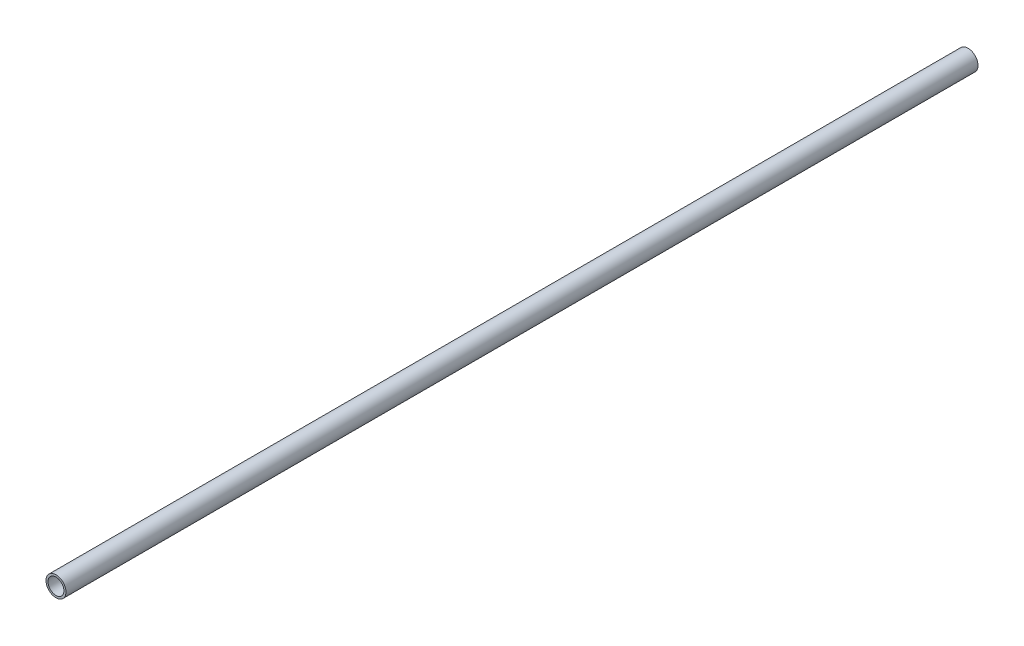
ISO-10303-21;
HEADER;
FILE_DESCRIPTION(('STEP AP214'),'2;1');
FILE_NAME('part.step','',(''),(''),'','','');
FILE_SCHEMA(('AUTOMOTIVE_DESIGN { 1 0 10303 214 1 1 1 1 }'));
ENDSEC;
DATA;
#1=APPLICATION_CONTEXT('core data for automotive mechanical design processes');
#2=APPLICATION_PROTOCOL_DEFINITION('international standard','automotive_design',2000,#1);
#3=PRODUCT_CONTEXT('',#1,'mechanical');
#4=PRODUCT('Part','Part','',(#3));
#5=PRODUCT_RELATED_PRODUCT_CATEGORY('part','',(#4));
#6=PRODUCT_DEFINITION_FORMATION('','',#4);
#7=PRODUCT_DEFINITION_CONTEXT('part definition',#1,'design');
#8=PRODUCT_DEFINITION('design','',#6,#7);
#9=PRODUCT_DEFINITION_SHAPE('','',#8);
#10=(LENGTH_UNIT() NAMED_UNIT(*) SI_UNIT(.MILLI.,.METRE.));
#11=(NAMED_UNIT(*) PLANE_ANGLE_UNIT() SI_UNIT($,.RADIAN.));
#12=(NAMED_UNIT(*) SI_UNIT($,.STERADIAN.) SOLID_ANGLE_UNIT());
#13=UNCERTAINTY_MEASURE_WITH_UNIT(LENGTH_MEASURE(1.E-05),#10,'distance_accuracy_value','');
#14=(GEOMETRIC_REPRESENTATION_CONTEXT(3) GLOBAL_UNCERTAINTY_ASSIGNED_CONTEXT((#13)) GLOBAL_UNIT_ASSIGNED_CONTEXT((#10,
#11,#12)) REPRESENTATION_CONTEXT('',''));
#15=CARTESIAN_POINT('',(0.,0.,0.));
#16=DIRECTION('',(0.,0.,1.));
#17=DIRECTION('',(1.,0.,0.));
#18=AXIS2_PLACEMENT_3D('',#15,#16,#17);
#19=CARTESIAN_POINT('',(0.,0.,-1524.));
#20=DIRECTION('',(0.,0.,1.));
#21=DIRECTION('',(1.,0.,0.));
#22=AXIS2_PLACEMENT_3D('',#19,#20,#21);
#23=CYLINDRICAL_SURFACE('',#22,16.7005);
#24=CARTESIAN_POINT('',(0.,0.,-1524.));
#25=DIRECTION('',(0.,0.,1.));
#26=DIRECTION('',(1.,0.,0.));
#27=AXIS2_PLACEMENT_3D('',#24,#25,#26);
#28=CIRCLE('',#27,16.7005);
#29=CARTESIAN_POINT('',(16.7005,0.,-1524.));
#30=VERTEX_POINT('',#29);
#31=EDGE_CURVE('E10',#30,#30,#28,.T.);
#32=ORIENTED_EDGE('',*,*,#31,.T.);
#33=EDGE_LOOP('',(#32));
#34=FACE_BOUND('',#33,.T.);
#35=CARTESIAN_POINT('',(0.,0.,0.));
#36=DIRECTION('',(0.,0.,1.));
#37=DIRECTION('',(1.,0.,0.));
#38=AXIS2_PLACEMENT_3D('',#35,#36,#37);
#39=CIRCLE('',#38,16.7005);
#40=CARTESIAN_POINT('',(16.7005,0.,0.));
#41=VERTEX_POINT('',#40);
#42=EDGE_CURVE('E36',#41,#41,#39,.T.);
#43=ORIENTED_EDGE('',*,*,#42,.F.);
#44=EDGE_LOOP('',(#43));
#45=FACE_BOUND('',#44,.T.);
#46=ADVANCED_FACE('F33',(#34,#45),#23,.T.);
#47=CARTESIAN_POINT('',(0.,0.,-1524.));
#48=DIRECTION('',(0.,0.,1.));
#49=DIRECTION('',(1.,0.,0.));
#50=AXIS2_PLACEMENT_3D('',#47,#48,#49);
#51=PLANE('',#50);
#52=CARTESIAN_POINT('',(0.,0.,-1524.));
#53=DIRECTION('',(0.,0.,1.));
#54=DIRECTION('',(1.,0.,0.));
#55=AXIS2_PLACEMENT_3D('',#52,#53,#54);
#56=CIRCLE('',#55,13.3223);
#57=CARTESIAN_POINT('',(13.3223,0.,-1524.));
#58=VERTEX_POINT('',#57);
#59=EDGE_CURVE('E43',#58,#58,#56,.T.);
#60=ORIENTED_EDGE('',*,*,#59,.T.);
#61=EDGE_LOOP('',(#60));
#62=FACE_BOUND('',#61,.T.);
#63=ORIENTED_EDGE('',*,*,#31,.F.);
#64=EDGE_LOOP('',(#63));
#65=FACE_BOUND('',#64,.T.);
#66=ADVANCED_FACE('F51',(#62,#65),#51,.F.);
#67=CARTESIAN_POINT('',(0.,0.,0.));
#68=DIRECTION('',(0.,0.,1.));
#69=DIRECTION('',(1.,0.,0.));
#70=AXIS2_PLACEMENT_3D('',#67,#68,#69);
#71=PLANE('',#70);
#72=CARTESIAN_POINT('',(0.,0.,0.));
#73=DIRECTION('',(0.,0.,1.));
#74=DIRECTION('',(1.,0.,0.));
#75=AXIS2_PLACEMENT_3D('',#72,#73,#74);
#76=CIRCLE('',#75,13.3223);
#77=CARTESIAN_POINT('',(13.3223,0.,0.));
#78=VERTEX_POINT('',#77);
#79=EDGE_CURVE('E45',#78,#78,#76,.T.);
#80=ORIENTED_EDGE('',*,*,#79,.F.);
#81=EDGE_LOOP('',(#80));
#82=FACE_BOUND('',#81,.T.);
#83=ORIENTED_EDGE('',*,*,#42,.T.);
#84=EDGE_LOOP('',(#83));
#85=FACE_BOUND('',#84,.T.);
#86=ADVANCED_FACE('F57',(#82,#85),#71,.T.);
#87=CARTESIAN_POINT('',(0.,0.,-1524.));
#88=DIRECTION('',(0.,0.,1.));
#89=DIRECTION('',(1.,0.,0.));
#90=AXIS2_PLACEMENT_3D('',#87,#88,#89);
#91=CYLINDRICAL_SURFACE('',#90,13.3223);
#92=ORIENTED_EDGE('',*,*,#59,.F.);
#93=EDGE_LOOP('',(#92));
#94=FACE_BOUND('',#93,.T.);
#95=ORIENTED_EDGE('',*,*,#79,.T.);
#96=EDGE_LOOP('',(#95));
#97=FACE_BOUND('',#96,.T.);
#98=ADVANCED_FACE('F54',(#94,#97),#91,.F.);
#99=CLOSED_SHELL('',(#46,#66,#86,#98));
#100=MANIFOLD_SOLID_BREP('B2',#99);
#101=ADVANCED_BREP_SHAPE_REPRESENTATION('',(#18,#100),#14);
#102=SHAPE_DEFINITION_REPRESENTATION(#9,#101);
ENDSEC;
END-ISO-10303-21;
